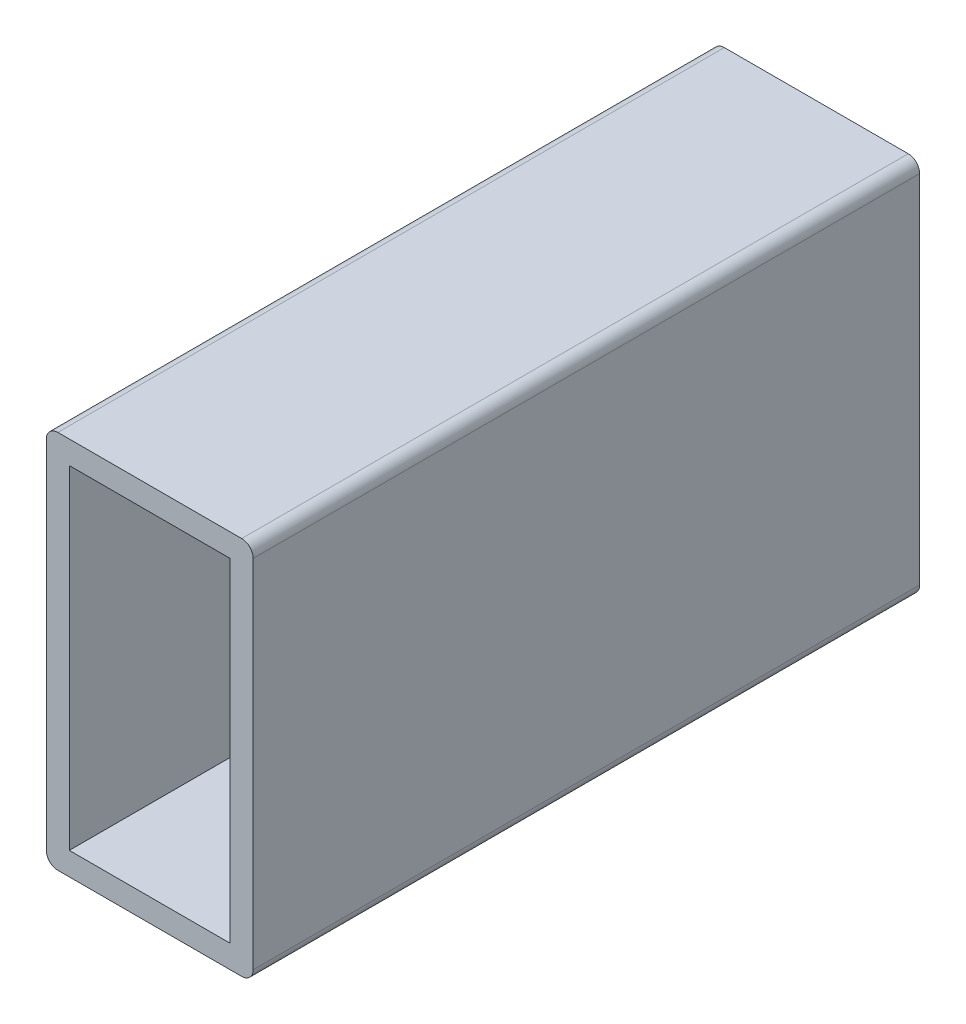
ISO-10303-21;
HEADER;
FILE_DESCRIPTION(('STEP AP214'),'2;1');
FILE_NAME('part.step','',(''),(''),'','','');
FILE_SCHEMA(('AUTOMOTIVE_DESIGN { 1 0 10303 214 1 1 1 1 }'));
ENDSEC;
DATA;
#1=APPLICATION_CONTEXT('core data for automotive mechanical design processes');
#2=APPLICATION_PROTOCOL_DEFINITION('international standard','automotive_design',2000,#1);
#3=PRODUCT_CONTEXT('',#1,'mechanical');
#4=PRODUCT('Part','Part','',(#3));
#5=PRODUCT_RELATED_PRODUCT_CATEGORY('part','',(#4));
#6=PRODUCT_DEFINITION_FORMATION('','',#4);
#7=PRODUCT_DEFINITION_CONTEXT('part definition',#1,'design');
#8=PRODUCT_DEFINITION('design','',#6,#7);
#9=PRODUCT_DEFINITION_SHAPE('','',#8);
#10=(LENGTH_UNIT() NAMED_UNIT(*) SI_UNIT(.MILLI.,.METRE.));
#11=(NAMED_UNIT(*) PLANE_ANGLE_UNIT() SI_UNIT($,.RADIAN.));
#12=(NAMED_UNIT(*) SI_UNIT($,.STERADIAN.) SOLID_ANGLE_UNIT());
#13=UNCERTAINTY_MEASURE_WITH_UNIT(LENGTH_MEASURE(1.E-05),#10,'distance_accuracy_value','');
#14=(GEOMETRIC_REPRESENTATION_CONTEXT(3) GLOBAL_UNCERTAINTY_ASSIGNED_CONTEXT((#13)) GLOBAL_UNIT_ASSIGNED_CONTEXT((#10,
#11,#12)) REPRESENTATION_CONTEXT('',''));
#15=CARTESIAN_POINT('',(0.,0.,0.));
#16=DIRECTION('',(0.,0.,1.));
#17=DIRECTION('',(1.,0.,0.));
#18=AXIS2_PLACEMENT_3D('',#15,#16,#17);
#19=CARTESIAN_POINT('',(0.,0.,290.));
#20=DIRECTION('',(0.,0.,-1.));
#21=DIRECTION('',(-1.,0.,0.));
#22=AXIS2_PLACEMENT_3D('',#19,#20,#21);
#23=PLANE('',#22);
#24=DIRECTION('',(-1.,0.,0.));
#25=VECTOR('',#24,1.);
#26=CARTESIAN_POINT('',(0.,165.,290.));
#27=LINE('',#26,#25);
#28=CARTESIAN_POINT('',(84.9999999999999,165.,290.));
#29=VERTEX_POINT('',#28);
#30=CARTESIAN_POINT('',(4.99999999999996,165.,290.));
#31=VERTEX_POINT('',#30);
#32=EDGE_CURVE('E171',#29,#31,#27,.T.);
#33=ORIENTED_EDGE('',*,*,#32,.T.);
#34=CARTESIAN_POINT('',(4.99999999999996,160.,290.));
#35=DIRECTION('',(0.,0.,-1.));
#36=DIRECTION('',(-1.,0.,0.));
#37=AXIS2_PLACEMENT_3D('',#34,#35,#36);
#38=CIRCLE('',#37,5.);
#39=CARTESIAN_POINT('',(0.,160.,290.));
#40=VERTEX_POINT('',#39);
#41=EDGE_CURVE('E207',#31,#40,#38,.F.);
#42=ORIENTED_EDGE('',*,*,#41,.T.);
#43=DIRECTION('',(0.,-1.,0.));
#44=VECTOR('',#43,1.);
#45=CARTESIAN_POINT('',(0.,0.,290.));
#46=LINE('',#45,#44);
#47=CARTESIAN_POINT('',(0.,5.,290.));
#48=VERTEX_POINT('',#47);
#49=EDGE_CURVE('E163',#40,#48,#46,.T.);
#50=ORIENTED_EDGE('',*,*,#49,.T.);
#51=CARTESIAN_POINT('',(5.,5.,290.));
#52=DIRECTION('',(0.,0.,-1.));
#53=DIRECTION('',(-1.,0.,0.));
#54=AXIS2_PLACEMENT_3D('',#51,#52,#53);
#55=CIRCLE('',#54,5.);
#56=CARTESIAN_POINT('',(5.,0.,290.));
#57=VERTEX_POINT('',#56);
#58=EDGE_CURVE('E202',#48,#57,#55,.F.);
#59=ORIENTED_EDGE('',*,*,#58,.T.);
#60=DIRECTION('',(1.,0.,0.));
#61=VECTOR('',#60,1.);
#62=CARTESIAN_POINT('',(0.,0.,290.));
#63=LINE('',#62,#61);
#64=CARTESIAN_POINT('',(85.,0.,290.));
#65=VERTEX_POINT('',#64);
#66=EDGE_CURVE('E166',#57,#65,#63,.T.);
#67=ORIENTED_EDGE('',*,*,#66,.T.);
#68=CARTESIAN_POINT('',(85.,5.,290.));
#69=DIRECTION('',(0.,0.,-1.));
#70=DIRECTION('',(-1.,0.,0.));
#71=AXIS2_PLACEMENT_3D('',#68,#69,#70);
#72=CIRCLE('',#71,5.);
#73=CARTESIAN_POINT('',(90.,5.,290.));
#74=VERTEX_POINT('',#73);
#75=EDGE_CURVE('E58',#65,#74,#72,.F.);
#76=ORIENTED_EDGE('',*,*,#75,.T.);
#77=DIRECTION('',(0.,1.,0.));
#78=VECTOR('',#77,1.);
#79=CARTESIAN_POINT('',(90.,0.,290.));
#80=LINE('',#79,#78);
#81=CARTESIAN_POINT('',(90.,160.,290.));
#82=VERTEX_POINT('',#81);
#83=EDGE_CURVE('E169',#74,#82,#80,.T.);
#84=ORIENTED_EDGE('',*,*,#83,.T.);
#85=CARTESIAN_POINT('',(85.,160.,290.));
#86=DIRECTION('',(0.,0.,-1.));
#87=DIRECTION('',(-1.,0.,0.));
#88=AXIS2_PLACEMENT_3D('',#85,#86,#87);
#89=CIRCLE('',#88,5.);
#90=EDGE_CURVE('E205',#82,#29,#89,.F.);
#91=ORIENTED_EDGE('',*,*,#90,.T.);
#92=EDGE_LOOP('',(#33,#42,#50,#59,#67,#76,#84,#91));
#93=FACE_BOUND('',#92,.T.);
#94=DIRECTION('',(0.,-1.,0.));
#95=VECTOR('',#94,1.);
#96=CARTESIAN_POINT('',(10.,0.,290.));
#97=LINE('',#96,#95);
#98=CARTESIAN_POINT('',(9.99999999999996,155.,290.));
#99=VERTEX_POINT('',#98);
#100=CARTESIAN_POINT('',(10.,10.,290.));
#101=VERTEX_POINT('',#100);
#102=EDGE_CURVE('E152',#99,#101,#97,.T.);
#103=ORIENTED_EDGE('',*,*,#102,.F.);
#104=DIRECTION('',(-1.,0.,0.));
#105=VECTOR('',#104,1.);
#106=CARTESIAN_POINT('',(0.,155.,290.));
#107=LINE('',#106,#105);
#108=CARTESIAN_POINT('',(80.,155.,290.));
#109=VERTEX_POINT('',#108);
#110=EDGE_CURVE('E161',#109,#99,#107,.T.);
#111=ORIENTED_EDGE('',*,*,#110,.F.);
#112=DIRECTION('',(0.,1.,0.));
#113=VECTOR('',#112,1.);
#114=CARTESIAN_POINT('',(80.,0.,290.));
#115=LINE('',#114,#113);
#116=CARTESIAN_POINT('',(80.,10.,290.));
#117=VERTEX_POINT('',#116);
#118=EDGE_CURVE('E159',#117,#109,#115,.T.);
#119=ORIENTED_EDGE('',*,*,#118,.F.);
#120=DIRECTION('',(1.,0.,0.));
#121=VECTOR('',#120,1.);
#122=CARTESIAN_POINT('',(0.,10.,290.));
#123=LINE('',#122,#121);
#124=EDGE_CURVE('E141',#101,#117,#123,.T.);
#125=ORIENTED_EDGE('',*,*,#124,.F.);
#126=EDGE_LOOP('',(#103,#111,#119,#125));
#127=FACE_BOUND('',#126,.T.);
#128=ADVANCED_FACE('F36',(#93,#127),#23,.F.);
#129=CARTESIAN_POINT('',(0.,0.,290.));
#130=DIRECTION('',(1.,0.,0.));
#131=DIRECTION('',(0.,1.,0.));
#132=AXIS2_PLACEMENT_3D('',#129,#130,#131);
#133=PLANE('',#132);
#134=ORIENTED_EDGE('',*,*,#49,.F.);
#135=DIRECTION('',(0.,0.,-1.));
#136=VECTOR('',#135,1.);
#137=CARTESIAN_POINT('',(0.,160.,290.));
#138=LINE('',#137,#136);
#139=CARTESIAN_POINT('',(0.,160.,0.));
#140=VERTEX_POINT('',#139);
#141=EDGE_CURVE('E186',#40,#140,#138,.T.);
#142=ORIENTED_EDGE('',*,*,#141,.T.);
#143=DIRECTION('',(0.,-1.,0.));
#144=VECTOR('',#143,1.);
#145=CARTESIAN_POINT('',(0.,0.,0.));
#146=LINE('',#145,#144);
#147=CARTESIAN_POINT('',(0.,5.,0.));
#148=VERTEX_POINT('',#147);
#149=EDGE_CURVE('E175',#140,#148,#146,.T.);
#150=ORIENTED_EDGE('',*,*,#149,.T.);
#151=DIRECTION('',(0.,0.,-1.));
#152=VECTOR('',#151,1.);
#153=CARTESIAN_POINT('',(0.,5.,290.));
#154=LINE('',#153,#152);
#155=EDGE_CURVE('E174',#148,#48,#154,.F.);
#156=ORIENTED_EDGE('',*,*,#155,.T.);
#157=EDGE_LOOP('',(#134,#142,#150,#156));
#158=FACE_BOUND('',#157,.T.);
#159=ADVANCED_FACE('F245',(#158),#133,.F.);
#160=CARTESIAN_POINT('',(0.,0.,290.));
#161=DIRECTION('',(0.,1.,0.));
#162=DIRECTION('',(0.,0.,1.));
#163=AXIS2_PLACEMENT_3D('',#160,#161,#162);
#164=PLANE('',#163);
#165=DIRECTION('',(1.,0.,0.));
#166=VECTOR('',#165,1.);
#167=CARTESIAN_POINT('',(0.,0.,0.));
#168=LINE('',#167,#166);
#169=CARTESIAN_POINT('',(5.,0.,0.));
#170=VERTEX_POINT('',#169);
#171=CARTESIAN_POINT('',(85.,0.,0.));
#172=VERTEX_POINT('',#171);
#173=EDGE_CURVE('E178',#170,#172,#168,.T.);
#174=ORIENTED_EDGE('',*,*,#173,.T.);
#175=DIRECTION('',(0.,0.,-1.));
#176=VECTOR('',#175,1.);
#177=CARTESIAN_POINT('',(85.,0.,290.));
#178=LINE('',#177,#176);
#179=EDGE_CURVE('E11',#172,#65,#178,.F.);
#180=ORIENTED_EDGE('',*,*,#179,.T.);
#181=ORIENTED_EDGE('',*,*,#66,.F.);
#182=DIRECTION('',(0.,0.,-1.));
#183=VECTOR('',#182,1.);
#184=CARTESIAN_POINT('',(5.,0.,290.));
#185=LINE('',#184,#183);
#186=EDGE_CURVE('E44',#57,#170,#185,.T.);
#187=ORIENTED_EDGE('',*,*,#186,.T.);
#188=EDGE_LOOP('',(#174,#180,#181,#187));
#189=FACE_BOUND('',#188,.T.);
#190=ADVANCED_FACE('F217',(#189),#164,.F.);
#191=CARTESIAN_POINT('',(90.,0.,290.));
#192=DIRECTION('',(-1.,0.,0.));
#193=DIRECTION('',(0.,-1.,0.));
#194=AXIS2_PLACEMENT_3D('',#191,#192,#193);
#195=PLANE('',#194);
#196=DIRECTION('',(0.,1.,0.));
#197=VECTOR('',#196,1.);
#198=CARTESIAN_POINT('',(90.,0.,0.));
#199=LINE('',#198,#197);
#200=CARTESIAN_POINT('',(90.,5.,0.));
#201=VERTEX_POINT('',#200);
#202=CARTESIAN_POINT('',(90.,160.,0.));
#203=VERTEX_POINT('',#202);
#204=EDGE_CURVE('E181',#201,#203,#199,.T.);
#205=ORIENTED_EDGE('',*,*,#204,.T.);
#206=DIRECTION('',(0.,0.,-1.));
#207=VECTOR('',#206,1.);
#208=CARTESIAN_POINT('',(90.,160.,290.));
#209=LINE('',#208,#207);
#210=EDGE_CURVE('E51',#203,#82,#209,.F.);
#211=ORIENTED_EDGE('',*,*,#210,.T.);
#212=ORIENTED_EDGE('',*,*,#83,.F.);
#213=DIRECTION('',(0.,0.,-1.));
#214=VECTOR('',#213,1.);
#215=CARTESIAN_POINT('',(90.,5.,290.));
#216=LINE('',#215,#214);
#217=EDGE_CURVE('E209',#74,#201,#216,.T.);
#218=ORIENTED_EDGE('',*,*,#217,.T.);
#219=EDGE_LOOP('',(#205,#211,#212,#218));
#220=FACE_BOUND('',#219,.T.);
#221=ADVANCED_FACE('F228',(#220),#195,.F.);
#222=CARTESIAN_POINT('',(0.,165.,290.));
#223=DIRECTION('',(0.,-1.,0.));
#224=DIRECTION('',(0.,0.,-1.));
#225=AXIS2_PLACEMENT_3D('',#222,#223,#224);
#226=PLANE('',#225);
#227=DIRECTION('',(-1.,0.,0.));
#228=VECTOR('',#227,1.);
#229=CARTESIAN_POINT('',(0.,165.,0.));
#230=LINE('',#229,#228);
#231=CARTESIAN_POINT('',(84.9999999999999,165.,0.));
#232=VERTEX_POINT('',#231);
#233=CARTESIAN_POINT('',(4.99999999999996,165.,0.));
#234=VERTEX_POINT('',#233);
#235=EDGE_CURVE('E167',#232,#234,#230,.T.);
#236=ORIENTED_EDGE('',*,*,#235,.T.);
#237=DIRECTION('',(0.,0.,-1.));
#238=VECTOR('',#237,1.);
#239=CARTESIAN_POINT('',(4.99999999999996,165.,290.));
#240=LINE('',#239,#238);
#241=EDGE_CURVE('E200',#234,#31,#240,.F.);
#242=ORIENTED_EDGE('',*,*,#241,.T.);
#243=ORIENTED_EDGE('',*,*,#32,.F.);
#244=DIRECTION('',(0.,0.,-1.));
#245=VECTOR('',#244,1.);
#246=CARTESIAN_POINT('',(85.,165.,290.));
#247=LINE('',#246,#245);
#248=EDGE_CURVE('E197',#29,#232,#247,.T.);
#249=ORIENTED_EDGE('',*,*,#248,.T.);
#250=EDGE_LOOP('',(#236,#242,#243,#249));
#251=FACE_BOUND('',#250,.T.);
#252=ADVANCED_FACE('F237',(#251),#226,.F.);
#253=CARTESIAN_POINT('',(0.,0.,0.));
#254=DIRECTION('',(0.,0.,-1.));
#255=DIRECTION('',(-1.,0.,0.));
#256=AXIS2_PLACEMENT_3D('',#253,#254,#255);
#257=PLANE('',#256);
#258=CARTESIAN_POINT('',(45.,82.5,0.));
#259=DIRECTION('',(0.,0.,-1.));
#260=DIRECTION('',(-1.,0.,0.));
#261=AXIS2_PLACEMENT_3D('',#258,#259,#260);
#262=CIRCLE('',#261,15.);
#263=CARTESIAN_POINT('',(30.,82.5,0.));
#264=VERTEX_POINT('',#263);
#265=EDGE_CURVE('E387',#264,#264,#262,.T.);
#266=ORIENTED_EDGE('',*,*,#265,.F.);
#267=EDGE_LOOP('',(#266));
#268=FACE_BOUND('',#267,.T.);
#269=ORIENTED_EDGE('',*,*,#149,.F.);
#270=CARTESIAN_POINT('',(4.99999999999996,160.,0.));
#271=DIRECTION('',(0.,0.,-1.));
#272=DIRECTION('',(-1.,0.,0.));
#273=AXIS2_PLACEMENT_3D('',#270,#271,#272);
#274=CIRCLE('',#273,5.);
#275=EDGE_CURVE('E195',#140,#234,#274,.T.);
#276=ORIENTED_EDGE('',*,*,#275,.T.);
#277=ORIENTED_EDGE('',*,*,#235,.F.);
#278=CARTESIAN_POINT('',(85.,160.,0.));
#279=DIRECTION('',(0.,0.,-1.));
#280=DIRECTION('',(-1.,0.,0.));
#281=AXIS2_PLACEMENT_3D('',#278,#279,#280);
#282=CIRCLE('',#281,5.);
#283=EDGE_CURVE('E193',#232,#203,#282,.T.);
#284=ORIENTED_EDGE('',*,*,#283,.T.);
#285=ORIENTED_EDGE('',*,*,#204,.F.);
#286=CARTESIAN_POINT('',(85.,5.,0.));
#287=DIRECTION('',(0.,0.,-1.));
#288=DIRECTION('',(-1.,0.,0.));
#289=AXIS2_PLACEMENT_3D('',#286,#287,#288);
#290=CIRCLE('',#289,5.);
#291=EDGE_CURVE('E191',#201,#172,#290,.T.);
#292=ORIENTED_EDGE('',*,*,#291,.T.);
#293=ORIENTED_EDGE('',*,*,#173,.F.);
#294=CARTESIAN_POINT('',(5.,5.,0.));
#295=DIRECTION('',(0.,0.,-1.));
#296=DIRECTION('',(-1.,0.,0.));
#297=AXIS2_PLACEMENT_3D('',#294,#295,#296);
#298=CIRCLE('',#297,5.);
#299=EDGE_CURVE('E189',#170,#148,#298,.T.);
#300=ORIENTED_EDGE('',*,*,#299,.T.);
#301=EDGE_LOOP('',(#269,#276,#277,#284,#285,#292,#293,#300));
#302=FACE_BOUND('',#301,.T.);
#303=ADVANCED_FACE('F223',(#268,#302),#257,.T.);
#304=CARTESIAN_POINT('',(10.,0.,290.));
#305=DIRECTION('',(1.,0.,0.));
#306=DIRECTION('',(0.,1.,0.));
#307=AXIS2_PLACEMENT_3D('',#304,#305,#306);
#308=PLANE('',#307);
#309=DIRECTION('',(0.,-1.,0.));
#310=VECTOR('',#309,1.);
#311=CARTESIAN_POINT('',(10.,0.,10.));
#312=LINE('',#311,#310);
#313=CARTESIAN_POINT('',(9.99999999999996,155.,10.));
#314=VERTEX_POINT('',#313);
#315=CARTESIAN_POINT('',(10.,10.,10.));
#316=VERTEX_POINT('',#315);
#317=EDGE_CURVE('E132',#314,#316,#312,.T.);
#318=ORIENTED_EDGE('',*,*,#317,.F.);
#319=DIRECTION('',(0.,0.,-1.));
#320=VECTOR('',#319,1.);
#321=CARTESIAN_POINT('',(9.99999999999996,155.,290.));
#322=LINE('',#321,#320);
#323=EDGE_CURVE('E155',#99,#314,#322,.T.);
#324=ORIENTED_EDGE('',*,*,#323,.F.);
#325=ORIENTED_EDGE('',*,*,#102,.T.);
#326=DIRECTION('',(0.,0.,-1.));
#327=VECTOR('',#326,1.);
#328=CARTESIAN_POINT('',(10.,10.,290.));
#329=LINE('',#328,#327);
#330=EDGE_CURVE('E145',#101,#316,#329,.T.);
#331=ORIENTED_EDGE('',*,*,#330,.T.);
#332=EDGE_LOOP('',(#318,#324,#325,#331));
#333=FACE_BOUND('',#332,.T.);
#334=ADVANCED_FACE('F267',(#333),#308,.T.);
#335=CARTESIAN_POINT('',(0.,10.,290.));
#336=DIRECTION('',(0.,1.,0.));
#337=DIRECTION('',(0.,0.,1.));
#338=AXIS2_PLACEMENT_3D('',#335,#336,#337);
#339=PLANE('',#338);
#340=DIRECTION('',(1.,0.,0.));
#341=VECTOR('',#340,1.);
#342=CARTESIAN_POINT('',(0.,10.,10.));
#343=LINE('',#342,#341);
#344=CARTESIAN_POINT('',(80.,10.,10.));
#345=VERTEX_POINT('',#344);
#346=EDGE_CURVE('E125',#316,#345,#343,.T.);
#347=ORIENTED_EDGE('',*,*,#346,.F.);
#348=ORIENTED_EDGE('',*,*,#330,.F.);
#349=ORIENTED_EDGE('',*,*,#124,.T.);
#350=DIRECTION('',(0.,0.,-1.));
#351=VECTOR('',#350,1.);
#352=CARTESIAN_POINT('',(80.,10.,290.));
#353=LINE('',#352,#351);
#354=EDGE_CURVE('E138',#117,#345,#353,.T.);
#355=ORIENTED_EDGE('',*,*,#354,.T.);
#356=EDGE_LOOP('',(#347,#348,#349,#355));
#357=FACE_BOUND('',#356,.T.);
#358=ADVANCED_FACE('F139',(#357),#339,.T.);
#359=CARTESIAN_POINT('',(80.,0.,290.));
#360=DIRECTION('',(-1.,0.,0.));
#361=DIRECTION('',(0.,-1.,0.));
#362=AXIS2_PLACEMENT_3D('',#359,#360,#361);
#363=PLANE('',#362);
#364=DIRECTION('',(0.,1.,0.));
#365=VECTOR('',#364,1.);
#366=CARTESIAN_POINT('',(80.,0.,10.));
#367=LINE('',#366,#365);
#368=CARTESIAN_POINT('',(80.,155.,10.));
#369=VERTEX_POINT('',#368);
#370=EDGE_CURVE('E129',#345,#369,#367,.T.);
#371=ORIENTED_EDGE('',*,*,#370,.F.);
#372=ORIENTED_EDGE('',*,*,#354,.F.);
#373=ORIENTED_EDGE('',*,*,#118,.T.);
#374=DIRECTION('',(0.,0.,-1.));
#375=VECTOR('',#374,1.);
#376=CARTESIAN_POINT('',(80.,155.,290.));
#377=LINE('',#376,#375);
#378=EDGE_CURVE('E146',#109,#369,#377,.T.);
#379=ORIENTED_EDGE('',*,*,#378,.T.);
#380=EDGE_LOOP('',(#371,#372,#373,#379));
#381=FACE_BOUND('',#380,.T.);
#382=ADVANCED_FACE('F148',(#381),#363,.T.);
#383=CARTESIAN_POINT('',(0.,155.,290.));
#384=DIRECTION('',(0.,-1.,0.));
#385=DIRECTION('',(0.,0.,-1.));
#386=AXIS2_PLACEMENT_3D('',#383,#384,#385);
#387=PLANE('',#386);
#388=DIRECTION('',(-1.,0.,0.));
#389=VECTOR('',#388,1.);
#390=CARTESIAN_POINT('',(0.,155.,10.));
#391=LINE('',#390,#389);
#392=EDGE_CURVE('E150',#369,#314,#391,.T.);
#393=ORIENTED_EDGE('',*,*,#392,.F.);
#394=ORIENTED_EDGE('',*,*,#378,.F.);
#395=ORIENTED_EDGE('',*,*,#110,.T.);
#396=ORIENTED_EDGE('',*,*,#323,.T.);
#397=EDGE_LOOP('',(#393,#394,#395,#396));
#398=FACE_BOUND('',#397,.T.);
#399=ADVANCED_FACE('F305',(#398),#387,.T.);
#400=CARTESIAN_POINT('',(0.,0.,10.));
#401=DIRECTION('',(0.,0.,-1.));
#402=DIRECTION('',(-1.,0.,0.));
#403=AXIS2_PLACEMENT_3D('',#400,#401,#402);
#404=PLANE('',#403);
#405=CARTESIAN_POINT('',(45.,82.5,10.));
#406=DIRECTION('',(0.,0.,-1.));
#407=DIRECTION('',(-1.,0.,0.));
#408=AXIS2_PLACEMENT_3D('',#405,#406,#407);
#409=CIRCLE('',#408,15.);
#410=CARTESIAN_POINT('',(30.,82.5,10.));
#411=VERTEX_POINT('',#410);
#412=EDGE_CURVE('E384',#411,#411,#409,.F.);
#413=ORIENTED_EDGE('',*,*,#412,.F.);
#414=EDGE_LOOP('',(#413));
#415=FACE_BOUND('',#414,.T.);
#416=ORIENTED_EDGE('',*,*,#317,.T.);
#417=ORIENTED_EDGE('',*,*,#346,.T.);
#418=ORIENTED_EDGE('',*,*,#370,.T.);
#419=ORIENTED_EDGE('',*,*,#392,.T.);
#420=EDGE_LOOP('',(#416,#417,#418,#419));
#421=FACE_BOUND('',#420,.T.);
#422=ADVANCED_FACE('F127',(#415,#421),#404,.F.);
#423=CARTESIAN_POINT('',(4.99999999999996,160.,290.));
#424=DIRECTION('',(0.,0.,-1.));
#425=DIRECTION('',(-1.,0.,0.));
#426=AXIS2_PLACEMENT_3D('',#423,#424,#425);
#427=CYLINDRICAL_SURFACE('',#426,5.);
#428=ORIENTED_EDGE('',*,*,#41,.F.);
#429=ORIENTED_EDGE('',*,*,#241,.F.);
#430=ORIENTED_EDGE('',*,*,#275,.F.);
#431=ORIENTED_EDGE('',*,*,#141,.F.);
#432=EDGE_LOOP('',(#428,#429,#430,#431));
#433=FACE_BOUND('',#432,.T.);
#434=ADVANCED_FACE('F242',(#433),#427,.T.);
#435=CARTESIAN_POINT('',(85.,160.,290.));
#436=DIRECTION('',(0.,0.,-1.));
#437=DIRECTION('',(-1.,0.,0.));
#438=AXIS2_PLACEMENT_3D('',#435,#436,#437);
#439=CYLINDRICAL_SURFACE('',#438,5.);
#440=ORIENTED_EDGE('',*,*,#90,.F.);
#441=ORIENTED_EDGE('',*,*,#210,.F.);
#442=ORIENTED_EDGE('',*,*,#283,.F.);
#443=ORIENTED_EDGE('',*,*,#248,.F.);
#444=EDGE_LOOP('',(#440,#441,#442,#443));
#445=FACE_BOUND('',#444,.T.);
#446=ADVANCED_FACE('F234',(#445),#439,.T.);
#447=CARTESIAN_POINT('',(85.,5.,290.));
#448=DIRECTION('',(0.,0.,-1.));
#449=DIRECTION('',(-1.,0.,0.));
#450=AXIS2_PLACEMENT_3D('',#447,#448,#449);
#451=CYLINDRICAL_SURFACE('',#450,5.);
#452=ORIENTED_EDGE('',*,*,#75,.F.);
#453=ORIENTED_EDGE('',*,*,#179,.F.);
#454=ORIENTED_EDGE('',*,*,#291,.F.);
#455=ORIENTED_EDGE('',*,*,#217,.F.);
#456=EDGE_LOOP('',(#452,#453,#454,#455));
#457=FACE_BOUND('',#456,.T.);
#458=ADVANCED_FACE('F227',(#457),#451,.T.);
#459=CARTESIAN_POINT('',(5.,5.,290.));
#460=DIRECTION('',(0.,0.,-1.));
#461=DIRECTION('',(-1.,0.,0.));
#462=AXIS2_PLACEMENT_3D('',#459,#460,#461);
#463=CYLINDRICAL_SURFACE('',#462,5.);
#464=ORIENTED_EDGE('',*,*,#58,.F.);
#465=ORIENTED_EDGE('',*,*,#155,.F.);
#466=ORIENTED_EDGE('',*,*,#299,.F.);
#467=ORIENTED_EDGE('',*,*,#186,.F.);
#468=EDGE_LOOP('',(#464,#465,#466,#467));
#469=FACE_BOUND('',#468,.T.);
#470=ADVANCED_FACE('F38',(#469),#463,.T.);
#471=CARTESIAN_POINT('',(45.,82.5,290.001));
#472=DIRECTION('',(0.,0.,-1.));
#473=DIRECTION('',(-1.,0.,0.));
#474=AXIS2_PLACEMENT_3D('',#471,#472,#473);
#475=CYLINDRICAL_SURFACE('',#474,15.);
#476=ORIENTED_EDGE('',*,*,#265,.T.);
#477=EDGE_LOOP('',(#476));
#478=FACE_BOUND('',#477,.T.);
#479=ORIENTED_EDGE('',*,*,#412,.T.);
#480=EDGE_LOOP('',(#479));
#481=FACE_BOUND('',#480,.T.);
#482=ADVANCED_FACE('F248',(#478,#481),#475,.F.);
#483=CLOSED_SHELL('',(#128,#159,#190,#221,#252,#303,#334,#358,#382,#399,#422,#434,#446,#458,
#470,#482));
#484=MANIFOLD_SOLID_BREP('B2',#483);
#485=ADVANCED_BREP_SHAPE_REPRESENTATION('',(#18,#484),#14);
#486=SHAPE_DEFINITION_REPRESENTATION(#9,#485);
ENDSEC;
END-ISO-10303-21;
